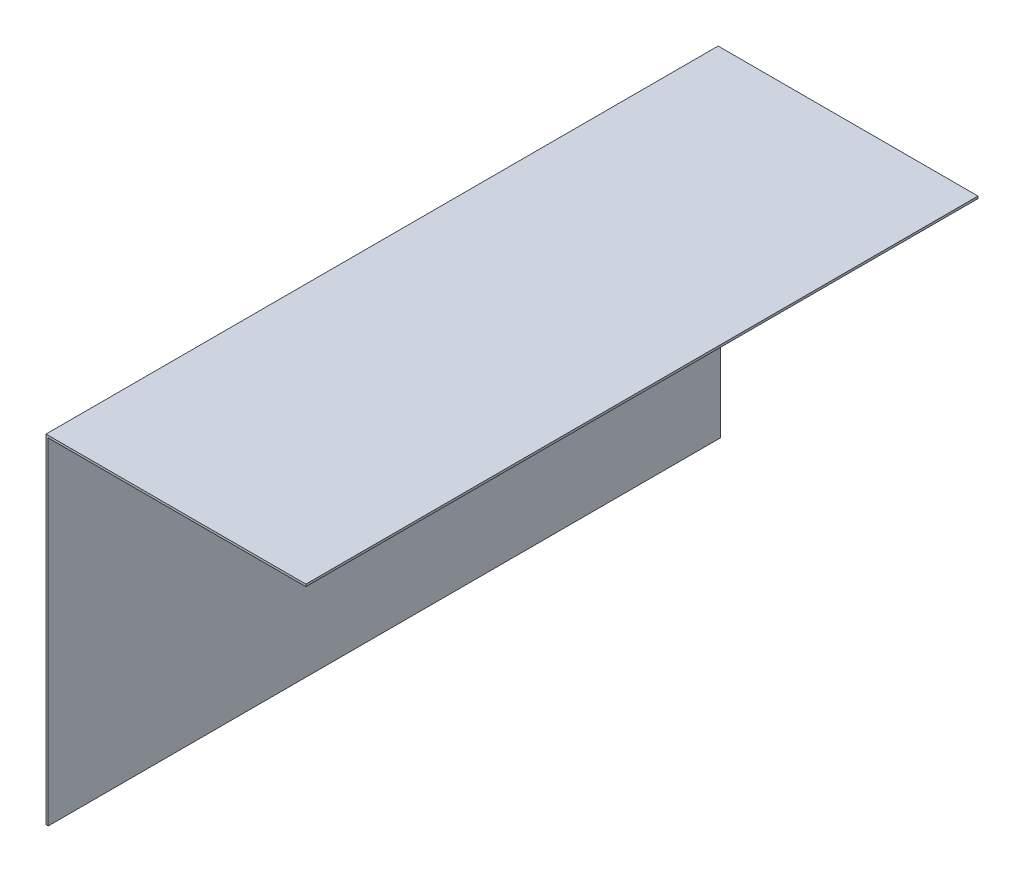
ISO-10303-21;
HEADER;
FILE_DESCRIPTION(('STEP AP214'),'2;1');
FILE_NAME('part.step','',(''),(''),'','','');
FILE_SCHEMA(('AUTOMOTIVE_DESIGN { 1 0 10303 214 1 1 1 1 }'));
ENDSEC;
DATA;
#1=APPLICATION_CONTEXT('core data for automotive mechanical design processes');
#2=APPLICATION_PROTOCOL_DEFINITION('international standard','automotive_design',2000,#1);
#3=PRODUCT_CONTEXT('',#1,'mechanical');
#4=PRODUCT('Part','Part','',(#3));
#5=PRODUCT_RELATED_PRODUCT_CATEGORY('part','',(#4));
#6=PRODUCT_DEFINITION_FORMATION('','',#4);
#7=PRODUCT_DEFINITION_CONTEXT('part definition',#1,'design');
#8=PRODUCT_DEFINITION('design','',#6,#7);
#9=PRODUCT_DEFINITION_SHAPE('','',#8);
#10=(LENGTH_UNIT() NAMED_UNIT(*) SI_UNIT(.MILLI.,.METRE.));
#11=(NAMED_UNIT(*) PLANE_ANGLE_UNIT() SI_UNIT($,.RADIAN.));
#12=(NAMED_UNIT(*) SI_UNIT($,.STERADIAN.) SOLID_ANGLE_UNIT());
#13=UNCERTAINTY_MEASURE_WITH_UNIT(LENGTH_MEASURE(1.E-05),#10,'distance_accuracy_value','');
#14=(GEOMETRIC_REPRESENTATION_CONTEXT(3) GLOBAL_UNCERTAINTY_ASSIGNED_CONTEXT((#13)) GLOBAL_UNIT_ASSIGNED_CONTEXT((#10,
#11,#12)) REPRESENTATION_CONTEXT('',''));
#15=CARTESIAN_POINT('',(0.,0.,0.));
#16=DIRECTION('',(0.,0.,1.));
#17=DIRECTION('',(1.,0.,0.));
#18=AXIS2_PLACEMENT_3D('',#15,#16,#17);
#19=CARTESIAN_POINT('',(0.,0.,600.));
#20=DIRECTION('',(-1.,0.,0.));
#21=DIRECTION('',(0.,-1.,0.));
#22=AXIS2_PLACEMENT_3D('',#19,#20,#21);
#23=PLANE('',#22);
#24=DIRECTION('',(0.,1.,0.));
#25=VECTOR('',#24,1.);
#26=CARTESIAN_POINT('',(0.,0.,0.));
#27=LINE('',#26,#25);
#28=CARTESIAN_POINT('',(0.,-300.,0.));
#29=VERTEX_POINT('',#28);
#30=CARTESIAN_POINT('',(0.,0.,0.));
#31=VERTEX_POINT('',#30);
#32=EDGE_CURVE('E117',#29,#31,#27,.T.);
#33=ORIENTED_EDGE('',*,*,#32,.T.);
#34=DIRECTION('',(0.,0.,-1.));
#35=VECTOR('',#34,1.);
#36=CARTESIAN_POINT('',(0.,0.,600.));
#37=LINE('',#36,#35);
#38=CARTESIAN_POINT('',(0.,0.,600.));
#39=VERTEX_POINT('',#38);
#40=EDGE_CURVE('E11',#39,#31,#37,.T.);
#41=ORIENTED_EDGE('',*,*,#40,.F.);
#42=DIRECTION('',(0.,1.,0.));
#43=VECTOR('',#42,1.);
#44=CARTESIAN_POINT('',(0.,0.,600.));
#45=LINE('',#44,#43);
#46=CARTESIAN_POINT('',(0.,-300.,600.));
#47=VERTEX_POINT('',#46);
#48=EDGE_CURVE('E127',#47,#39,#45,.T.);
#49=ORIENTED_EDGE('',*,*,#48,.F.);
#50=DIRECTION('',(0.,0.,-1.));
#51=VECTOR('',#50,1.);
#52=CARTESIAN_POINT('',(0.,-300.,600.));
#53=LINE('',#52,#51);
#54=EDGE_CURVE('E113',#47,#29,#53,.T.);
#55=ORIENTED_EDGE('',*,*,#54,.T.);
#56=EDGE_LOOP('',(#33,#41,#49,#55));
#57=FACE_BOUND('',#56,.T.);
#58=ADVANCED_FACE('F33',(#57),#23,.F.);
#59=CARTESIAN_POINT('',(0.,0.,600.));
#60=DIRECTION('',(0.,1.,0.));
#61=DIRECTION('',(0.,0.,1.));
#62=AXIS2_PLACEMENT_3D('',#59,#60,#61);
#63=PLANE('',#62);
#64=DIRECTION('',(1.,0.,0.));
#65=VECTOR('',#64,1.);
#66=CARTESIAN_POINT('',(0.,0.,0.));
#67=LINE('',#66,#65);
#68=CARTESIAN_POINT('',(230.,0.,0.));
#69=VERTEX_POINT('',#68);
#70=EDGE_CURVE('E120',#31,#69,#67,.T.);
#71=ORIENTED_EDGE('',*,*,#70,.T.);
#72=DIRECTION('',(0.,0.,-1.));
#73=VECTOR('',#72,1.);
#74=CARTESIAN_POINT('',(230.,0.,600.));
#75=LINE('',#74,#73);
#76=CARTESIAN_POINT('',(230.,0.,600.));
#77=VERTEX_POINT('',#76);
#78=EDGE_CURVE('E41',#77,#69,#75,.T.);
#79=ORIENTED_EDGE('',*,*,#78,.F.);
#80=DIRECTION('',(1.,0.,0.));
#81=VECTOR('',#80,1.);
#82=CARTESIAN_POINT('',(0.,0.,600.));
#83=LINE('',#82,#81);
#84=EDGE_CURVE('E86',#39,#77,#83,.T.);
#85=ORIENTED_EDGE('',*,*,#84,.F.);
#86=ORIENTED_EDGE('',*,*,#40,.T.);
#87=EDGE_LOOP('',(#71,#79,#85,#86));
#88=FACE_BOUND('',#87,.T.);
#89=ADVANCED_FACE('F151',(#88),#63,.F.);
#90=CARTESIAN_POINT('',(230.,0.,600.));
#91=DIRECTION('',(-1.,0.,0.));
#92=DIRECTION('',(0.,0.,1.));
#93=AXIS2_PLACEMENT_3D('',#90,#91,#92);
#94=PLANE('',#93);
#95=DIRECTION('',(0.,1.,0.));
#96=VECTOR('',#95,1.);
#97=CARTESIAN_POINT('',(230.,0.,0.));
#98=LINE('',#97,#96);
#99=CARTESIAN_POINT('',(230.,2.,0.));
#100=VERTEX_POINT('',#99);
#101=EDGE_CURVE('E122',#69,#100,#98,.T.);
#102=ORIENTED_EDGE('',*,*,#101,.T.);
#103=DIRECTION('',(0.,0.,-1.));
#104=VECTOR('',#103,1.);
#105=CARTESIAN_POINT('',(230.,2.,600.));
#106=LINE('',#105,#104);
#107=CARTESIAN_POINT('',(230.,2.,600.));
#108=VERTEX_POINT('',#107);
#109=EDGE_CURVE('E108',#108,#100,#106,.T.);
#110=ORIENTED_EDGE('',*,*,#109,.F.);
#111=DIRECTION('',(0.,1.,0.));
#112=VECTOR('',#111,1.);
#113=CARTESIAN_POINT('',(230.,0.,600.));
#114=LINE('',#113,#112);
#115=EDGE_CURVE('E99',#77,#108,#114,.T.);
#116=ORIENTED_EDGE('',*,*,#115,.F.);
#117=ORIENTED_EDGE('',*,*,#78,.T.);
#118=EDGE_LOOP('',(#102,#110,#116,#117));
#119=FACE_BOUND('',#118,.T.);
#120=ADVANCED_FACE('F133',(#119),#94,.F.);
#121=CARTESIAN_POINT('',(-2.,2.,600.));
#122=DIRECTION('',(0.,-1.,0.));
#123=DIRECTION('',(0.,0.,-1.));
#124=AXIS2_PLACEMENT_3D('',#121,#122,#123);
#125=PLANE('',#124);
#126=DIRECTION('',(-1.,0.,0.));
#127=VECTOR('',#126,1.);
#128=CARTESIAN_POINT('',(-2.,2.,0.));
#129=LINE('',#128,#127);
#130=CARTESIAN_POINT('',(-2.,2.,0.));
#131=VERTEX_POINT('',#130);
#132=EDGE_CURVE('E107',#100,#131,#129,.T.);
#133=ORIENTED_EDGE('',*,*,#132,.T.);
#134=DIRECTION('',(0.,0.,-1.));
#135=VECTOR('',#134,1.);
#136=CARTESIAN_POINT('',(-2.,2.,600.));
#137=LINE('',#136,#135);
#138=CARTESIAN_POINT('',(-2.,2.,600.));
#139=VERTEX_POINT('',#138);
#140=EDGE_CURVE('E104',#139,#131,#137,.T.);
#141=ORIENTED_EDGE('',*,*,#140,.F.);
#142=DIRECTION('',(-1.,0.,0.));
#143=VECTOR('',#142,1.);
#144=CARTESIAN_POINT('',(-2.,2.,600.));
#145=LINE('',#144,#143);
#146=EDGE_CURVE('E93',#108,#139,#145,.T.);
#147=ORIENTED_EDGE('',*,*,#146,.F.);
#148=ORIENTED_EDGE('',*,*,#109,.T.);
#149=EDGE_LOOP('',(#133,#141,#147,#148));
#150=FACE_BOUND('',#149,.T.);
#151=ADVANCED_FACE('F105',(#150),#125,.F.);
#152=CARTESIAN_POINT('',(-2.,2.,600.));
#153=DIRECTION('',(1.,0.,0.));
#154=DIRECTION('',(0.,0.,-1.));
#155=AXIS2_PLACEMENT_3D('',#152,#153,#154);
#156=PLANE('',#155);
#157=DIRECTION('',(0.,-1.,0.));
#158=VECTOR('',#157,1.);
#159=CARTESIAN_POINT('',(-2.,2.,0.));
#160=LINE('',#159,#158);
#161=CARTESIAN_POINT('',(-2.,-300.,0.));
#162=VERTEX_POINT('',#161);
#163=EDGE_CURVE('E72',#131,#162,#160,.T.);
#164=ORIENTED_EDGE('',*,*,#163,.T.);
#165=DIRECTION('',(0.,0.,-1.));
#166=VECTOR('',#165,1.);
#167=CARTESIAN_POINT('',(-2.,-300.,600.));
#168=LINE('',#167,#166);
#169=CARTESIAN_POINT('',(-2.,-300.,600.));
#170=VERTEX_POINT('',#169);
#171=EDGE_CURVE('E109',#170,#162,#168,.T.);
#172=ORIENTED_EDGE('',*,*,#171,.F.);
#173=DIRECTION('',(0.,-1.,0.));
#174=VECTOR('',#173,1.);
#175=CARTESIAN_POINT('',(-2.,2.,600.));
#176=LINE('',#175,#174);
#177=EDGE_CURVE('E97',#139,#170,#176,.T.);
#178=ORIENTED_EDGE('',*,*,#177,.F.);
#179=ORIENTED_EDGE('',*,*,#140,.T.);
#180=EDGE_LOOP('',(#164,#172,#178,#179));
#181=FACE_BOUND('',#180,.T.);
#182=ADVANCED_FACE('F111',(#181),#156,.F.);
#183=CARTESIAN_POINT('',(0.,-300.,600.));
#184=DIRECTION('',(0.,1.,0.));
#185=DIRECTION('',(0.,0.,1.));
#186=AXIS2_PLACEMENT_3D('',#183,#184,#185);
#187=PLANE('',#186);
#188=DIRECTION('',(1.,0.,0.));
#189=VECTOR('',#188,1.);
#190=CARTESIAN_POINT('',(0.,-300.,0.));
#191=LINE('',#190,#189);
#192=EDGE_CURVE('E78',#162,#29,#191,.T.);
#193=ORIENTED_EDGE('',*,*,#192,.T.);
#194=ORIENTED_EDGE('',*,*,#54,.F.);
#195=DIRECTION('',(1.,0.,0.));
#196=VECTOR('',#195,1.);
#197=CARTESIAN_POINT('',(0.,-300.,600.));
#198=LINE('',#197,#196);
#199=EDGE_CURVE('E49',#170,#47,#198,.T.);
#200=ORIENTED_EDGE('',*,*,#199,.F.);
#201=ORIENTED_EDGE('',*,*,#171,.T.);
#202=EDGE_LOOP('',(#193,#194,#200,#201));
#203=FACE_BOUND('',#202,.T.);
#204=ADVANCED_FACE('F140',(#203),#187,.F.);
#205=CARTESIAN_POINT('',(0.,0.,600.));
#206=DIRECTION('',(0.,0.,-1.));
#207=DIRECTION('',(-1.,0.,0.));
#208=AXIS2_PLACEMENT_3D('',#205,#206,#207);
#209=PLANE('',#208);
#210=ORIENTED_EDGE('',*,*,#48,.T.);
#211=ORIENTED_EDGE('',*,*,#84,.T.);
#212=ORIENTED_EDGE('',*,*,#115,.T.);
#213=ORIENTED_EDGE('',*,*,#146,.T.);
#214=ORIENTED_EDGE('',*,*,#177,.T.);
#215=ORIENTED_EDGE('',*,*,#199,.T.);
#216=EDGE_LOOP('',(#210,#211,#212,#213,#214,#215));
#217=FACE_BOUND('',#216,.T.);
#218=ADVANCED_FACE('F95',(#217),#209,.F.);
#219=CARTESIAN_POINT('',(0.,0.,0.));
#220=DIRECTION('',(0.,0.,-1.));
#221=DIRECTION('',(-1.,0.,0.));
#222=AXIS2_PLACEMENT_3D('',#219,#220,#221);
#223=PLANE('',#222);
#224=ORIENTED_EDGE('',*,*,#32,.F.);
#225=ORIENTED_EDGE('',*,*,#192,.F.);
#226=ORIENTED_EDGE('',*,*,#163,.F.);
#227=ORIENTED_EDGE('',*,*,#132,.F.);
#228=ORIENTED_EDGE('',*,*,#101,.F.);
#229=ORIENTED_EDGE('',*,*,#70,.F.);
#230=EDGE_LOOP('',(#224,#225,#226,#227,#228,#229));
#231=FACE_BOUND('',#230,.T.);
#232=ADVANCED_FACE('F136',(#231),#223,.T.);
#233=CLOSED_SHELL('',(#58,#89,#120,#151,#182,#204,#218,#232));
#234=MANIFOLD_SOLID_BREP('B2',#233);
#235=ADVANCED_BREP_SHAPE_REPRESENTATION('',(#18,#234),#14);
#236=SHAPE_DEFINITION_REPRESENTATION(#9,#235);
ENDSEC;
END-ISO-10303-21;
